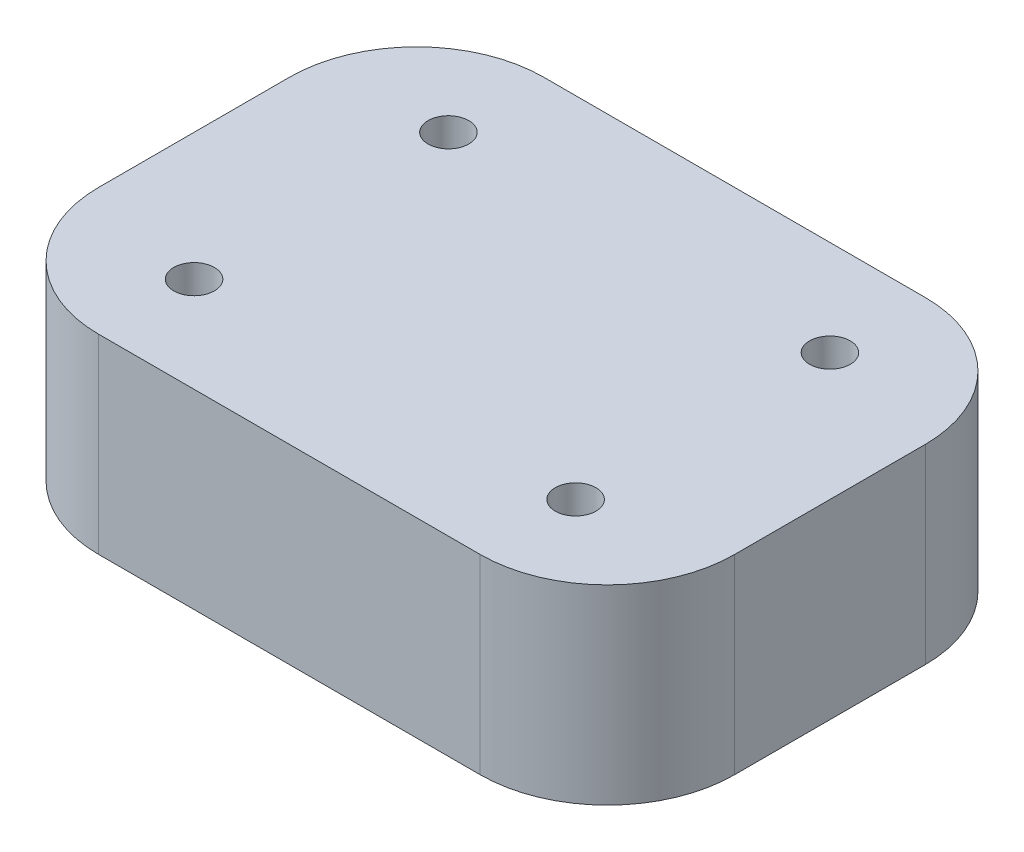
ISO-10303-21;
HEADER;
FILE_DESCRIPTION(('STEP AP214'),'2;1');
FILE_NAME('part.step','',(''),(''),'','','');
FILE_SCHEMA(('AUTOMOTIVE_DESIGN { 1 0 10303 214 1 1 1 1 }'));
ENDSEC;
DATA;
#1=APPLICATION_CONTEXT('core data for automotive mechanical design processes');
#2=APPLICATION_PROTOCOL_DEFINITION('international standard','automotive_design',2000,#1);
#3=PRODUCT_CONTEXT('',#1,'mechanical');
#4=PRODUCT('Part','Part','',(#3));
#5=PRODUCT_RELATED_PRODUCT_CATEGORY('part','',(#4));
#6=PRODUCT_DEFINITION_FORMATION('','',#4);
#7=PRODUCT_DEFINITION_CONTEXT('part definition',#1,'design');
#8=PRODUCT_DEFINITION('design','',#6,#7);
#9=PRODUCT_DEFINITION_SHAPE('','',#8);
#10=(LENGTH_UNIT() NAMED_UNIT(*) SI_UNIT(.MILLI.,.METRE.));
#11=(NAMED_UNIT(*) PLANE_ANGLE_UNIT() SI_UNIT($,.RADIAN.));
#12=(NAMED_UNIT(*) SI_UNIT($,.STERADIAN.) SOLID_ANGLE_UNIT());
#13=UNCERTAINTY_MEASURE_WITH_UNIT(LENGTH_MEASURE(1.E-05),#10,'distance_accuracy_value','');
#14=(GEOMETRIC_REPRESENTATION_CONTEXT(3) GLOBAL_UNCERTAINTY_ASSIGNED_CONTEXT((#13)) GLOBAL_UNIT_ASSIGNED_CONTEXT((#10,
#11,#12)) REPRESENTATION_CONTEXT('',''));
#15=CARTESIAN_POINT('',(0.,0.,0.));
#16=DIRECTION('',(0.,0.,1.));
#17=DIRECTION('',(1.,0.,0.));
#18=AXIS2_PLACEMENT_3D('',#15,#16,#17);
#19=CARTESIAN_POINT('',(0.,15.,0.));
#20=DIRECTION('',(0.,-1.,0.));
#21=DIRECTION('',(0.,0.,-1.));
#22=AXIS2_PLACEMENT_3D('',#19,#20,#21);
#23=PLANE('',#22);
#24=DIRECTION('',(-1.,0.,0.));
#25=VECTOR('',#24,1.);
#26=CARTESIAN_POINT('',(0.,15.,-35.));
#27=LINE('',#26,#25);
#28=CARTESIAN_POINT('',(40.,15.,-35.));
#29=VERTEX_POINT('',#28);
#30=CARTESIAN_POINT('',(10.,15.,-35.));
#31=VERTEX_POINT('',#30);
#32=EDGE_CURVE('E153',#29,#31,#27,.T.);
#33=ORIENTED_EDGE('',*,*,#32,.T.);
#34=CARTESIAN_POINT('',(10.,15.,-25.));
#35=DIRECTION('',(0.,-1.,0.));
#36=DIRECTION('',(0.,0.,-1.));
#37=AXIS2_PLACEMENT_3D('',#34,#35,#36);
#38=CIRCLE('',#37,10.);
#39=CARTESIAN_POINT('',(0.,15.,-25.));
#40=VERTEX_POINT('',#39);
#41=EDGE_CURVE('E183',#31,#40,#38,.F.);
#42=ORIENTED_EDGE('',*,*,#41,.T.);
#43=DIRECTION('',(0.,0.,1.));
#44=VECTOR('',#43,1.);
#45=CARTESIAN_POINT('',(0.,15.,0.));
#46=LINE('',#45,#44);
#47=CARTESIAN_POINT('',(0.,15.,-10.));
#48=VERTEX_POINT('',#47);
#49=EDGE_CURVE('E132',#40,#48,#46,.T.);
#50=ORIENTED_EDGE('',*,*,#49,.T.);
#51=CARTESIAN_POINT('',(10.,15.,-10.));
#52=DIRECTION('',(0.,-1.,0.));
#53=DIRECTION('',(0.,0.,-1.));
#54=AXIS2_PLACEMENT_3D('',#51,#52,#53);
#55=CIRCLE('',#54,10.);
#56=CARTESIAN_POINT('',(10.,15.,0.));
#57=VERTEX_POINT('',#56);
#58=EDGE_CURVE('E175',#48,#57,#55,.F.);
#59=ORIENTED_EDGE('',*,*,#58,.T.);
#60=DIRECTION('',(1.,0.,0.));
#61=VECTOR('',#60,1.);
#62=CARTESIAN_POINT('',(0.,15.,0.));
#63=LINE('',#62,#61);
#64=CARTESIAN_POINT('',(40.,15.,0.));
#65=VERTEX_POINT('',#64);
#66=EDGE_CURVE('E198',#57,#65,#63,.T.);
#67=ORIENTED_EDGE('',*,*,#66,.T.);
#68=CARTESIAN_POINT('',(40.,15.,-10.));
#69=DIRECTION('',(0.,-1.,0.));
#70=DIRECTION('',(0.,0.,-1.));
#71=AXIS2_PLACEMENT_3D('',#68,#69,#70);
#72=CIRCLE('',#71,10.);
#73=CARTESIAN_POINT('',(50.,15.,-10.));
#74=VERTEX_POINT('',#73);
#75=EDGE_CURVE('E67',#65,#74,#72,.F.);
#76=ORIENTED_EDGE('',*,*,#75,.T.);
#77=DIRECTION('',(0.,0.,-1.));
#78=VECTOR('',#77,1.);
#79=CARTESIAN_POINT('',(50.,15.,0.));
#80=LINE('',#79,#78);
#81=CARTESIAN_POINT('',(50.,15.,-25.));
#82=VERTEX_POINT('',#81);
#83=EDGE_CURVE('E206',#74,#82,#80,.T.);
#84=ORIENTED_EDGE('',*,*,#83,.T.);
#85=CARTESIAN_POINT('',(40.,15.,-25.));
#86=DIRECTION('',(0.,-1.,0.));
#87=DIRECTION('',(0.,0.,-1.));
#88=AXIS2_PLACEMENT_3D('',#85,#86,#87);
#89=CIRCLE('',#88,10.);
#90=EDGE_CURVE('E180',#82,#29,#89,.F.);
#91=ORIENTED_EDGE('',*,*,#90,.T.);
#92=EDGE_LOOP('',(#33,#42,#50,#59,#67,#76,#84,#91));
#93=FACE_BOUND('',#92,.T.);
#94=CARTESIAN_POINT('',(10.,15.,-27.5));
#95=DIRECTION('',(0.,1.,0.));
#96=DIRECTION('',(0.,0.,1.));
#97=AXIS2_PLACEMENT_3D('',#94,#95,#96);
#98=CIRCLE('',#97,1.6);
#99=CARTESIAN_POINT('',(10.,15.,-25.9));
#100=VERTEX_POINT('',#99);
#101=EDGE_CURVE('E142',#100,#100,#98,.T.);
#102=ORIENTED_EDGE('',*,*,#101,.F.);
#103=EDGE_LOOP('',(#102));
#104=FACE_BOUND('',#103,.T.);
#105=CARTESIAN_POINT('',(40.,15.,-27.5));
#106=DIRECTION('',(0.,1.,0.));
#107=DIRECTION('',(0.,0.,1.));
#108=AXIS2_PLACEMENT_3D('',#105,#106,#107);
#109=CIRCLE('',#108,1.6);
#110=CARTESIAN_POINT('',(40.,15.,-25.9));
#111=VERTEX_POINT('',#110);
#112=EDGE_CURVE('E218',#111,#111,#109,.T.);
#113=ORIENTED_EDGE('',*,*,#112,.F.);
#114=EDGE_LOOP('',(#113));
#115=FACE_BOUND('',#114,.T.);
#116=CARTESIAN_POINT('',(40.,15.,-7.5));
#117=DIRECTION('',(0.,1.,0.));
#118=DIRECTION('',(0.,0.,-1.));
#119=AXIS2_PLACEMENT_3D('',#116,#117,#118);
#120=CIRCLE('',#119,1.6);
#121=CARTESIAN_POINT('',(40.,15.,-9.1));
#122=VERTEX_POINT('',#121);
#123=EDGE_CURVE('E224',#122,#122,#120,.T.);
#124=ORIENTED_EDGE('',*,*,#123,.F.);
#125=EDGE_LOOP('',(#124));
#126=FACE_BOUND('',#125,.T.);
#127=CARTESIAN_POINT('',(10.,15.,-7.5));
#128=DIRECTION('',(0.,1.,0.));
#129=DIRECTION('',(0.,0.,-1.));
#130=AXIS2_PLACEMENT_3D('',#127,#128,#129);
#131=CIRCLE('',#130,1.6);
#132=CARTESIAN_POINT('',(10.,15.,-9.1));
#133=VERTEX_POINT('',#132);
#134=EDGE_CURVE('E232',#133,#133,#131,.T.);
#135=ORIENTED_EDGE('',*,*,#134,.F.);
#136=EDGE_LOOP('',(#135));
#137=FACE_BOUND('',#136,.T.);
#138=ADVANCED_FACE('F44',(#93,#104,#115,#126,#137),#23,.F.);
#139=CARTESIAN_POINT('',(0.,0.,0.));
#140=DIRECTION('',(0.,-1.,0.));
#141=DIRECTION('',(0.,0.,-1.));
#142=AXIS2_PLACEMENT_3D('',#139,#140,#141);
#143=PLANE('',#142);
#144=CARTESIAN_POINT('',(40.,0.,-7.5));
#145=DIRECTION('',(0.,1.,0.));
#146=DIRECTION('',(0.,0.,-1.));
#147=AXIS2_PLACEMENT_3D('',#144,#145,#146);
#148=CIRCLE('',#147,1.6);
#149=CARTESIAN_POINT('',(40.,0.,-9.1));
#150=VERTEX_POINT('',#149);
#151=EDGE_CURVE('E228',#150,#150,#148,.T.);
#152=ORIENTED_EDGE('',*,*,#151,.T.);
#153=EDGE_LOOP('',(#152));
#154=FACE_BOUND('',#153,.T.);
#155=CARTESIAN_POINT('',(10.,0.,-27.5));
#156=DIRECTION('',(0.,1.,0.));
#157=DIRECTION('',(0.,0.,1.));
#158=AXIS2_PLACEMENT_3D('',#155,#156,#157);
#159=CIRCLE('',#158,1.6);
#160=CARTESIAN_POINT('',(10.,0.,-25.9));
#161=VERTEX_POINT('',#160);
#162=EDGE_CURVE('E150',#161,#161,#159,.T.);
#163=ORIENTED_EDGE('',*,*,#162,.T.);
#164=EDGE_LOOP('',(#163));
#165=FACE_BOUND('',#164,.T.);
#166=DIRECTION('',(0.,0.,1.));
#167=VECTOR('',#166,1.);
#168=CARTESIAN_POINT('',(0.,0.,0.));
#169=LINE('',#168,#167);
#170=CARTESIAN_POINT('',(0.,0.,-25.));
#171=VERTEX_POINT('',#170);
#172=CARTESIAN_POINT('',(0.,0.,-10.));
#173=VERTEX_POINT('',#172);
#174=EDGE_CURVE('E129',#171,#173,#169,.T.);
#175=ORIENTED_EDGE('',*,*,#174,.F.);
#176=CARTESIAN_POINT('',(10.,0.,-25.));
#177=DIRECTION('',(0.,-1.,0.));
#178=DIRECTION('',(0.,0.,-1.));
#179=AXIS2_PLACEMENT_3D('',#176,#177,#178);
#180=CIRCLE('',#179,10.);
#181=CARTESIAN_POINT('',(10.,0.,-35.));
#182=VERTEX_POINT('',#181);
#183=EDGE_CURVE('E111',#171,#182,#180,.T.);
#184=ORIENTED_EDGE('',*,*,#183,.T.);
#185=DIRECTION('',(-1.,0.,0.));
#186=VECTOR('',#185,1.);
#187=CARTESIAN_POINT('',(0.,0.,-35.));
#188=LINE('',#187,#186);
#189=CARTESIAN_POINT('',(40.,0.,-35.));
#190=VERTEX_POINT('',#189);
#191=EDGE_CURVE('E158',#190,#182,#188,.T.);
#192=ORIENTED_EDGE('',*,*,#191,.F.);
#193=CARTESIAN_POINT('',(40.,0.,-25.));
#194=DIRECTION('',(0.,-1.,0.));
#195=DIRECTION('',(0.,0.,-1.));
#196=AXIS2_PLACEMENT_3D('',#193,#194,#195);
#197=CIRCLE('',#196,10.);
#198=CARTESIAN_POINT('',(50.,0.,-25.));
#199=VERTEX_POINT('',#198);
#200=EDGE_CURVE('E123',#190,#199,#197,.T.);
#201=ORIENTED_EDGE('',*,*,#200,.T.);
#202=DIRECTION('',(0.,0.,-1.));
#203=VECTOR('',#202,1.);
#204=CARTESIAN_POINT('',(50.,0.,0.));
#205=LINE('',#204,#203);
#206=CARTESIAN_POINT('',(50.,0.,-10.));
#207=VERTEX_POINT('',#206);
#208=EDGE_CURVE('E147',#207,#199,#205,.T.);
#209=ORIENTED_EDGE('',*,*,#208,.F.);
#210=CARTESIAN_POINT('',(40.,0.,-10.));
#211=DIRECTION('',(0.,-1.,0.));
#212=DIRECTION('',(0.,0.,-1.));
#213=AXIS2_PLACEMENT_3D('',#210,#211,#212);
#214=CIRCLE('',#213,10.);
#215=CARTESIAN_POINT('',(40.,0.,0.));
#216=VERTEX_POINT('',#215);
#217=EDGE_CURVE('E165',#207,#216,#214,.T.);
#218=ORIENTED_EDGE('',*,*,#217,.T.);
#219=DIRECTION('',(1.,0.,0.));
#220=VECTOR('',#219,1.);
#221=CARTESIAN_POINT('',(0.,0.,0.));
#222=LINE('',#221,#220);
#223=CARTESIAN_POINT('',(10.,0.,0.));
#224=VERTEX_POINT('',#223);
#225=EDGE_CURVE('E141',#224,#216,#222,.T.);
#226=ORIENTED_EDGE('',*,*,#225,.F.);
#227=CARTESIAN_POINT('',(10.,0.,-10.));
#228=DIRECTION('',(0.,-1.,0.));
#229=DIRECTION('',(0.,0.,-1.));
#230=AXIS2_PLACEMENT_3D('',#227,#228,#229);
#231=CIRCLE('',#230,10.);
#232=EDGE_CURVE('E134',#224,#173,#231,.T.);
#233=ORIENTED_EDGE('',*,*,#232,.T.);
#234=EDGE_LOOP('',(#175,#184,#192,#201,#209,#218,#226,#233));
#235=FACE_BOUND('',#234,.T.);
#236=CARTESIAN_POINT('',(40.,0.,-27.5));
#237=DIRECTION('',(0.,1.,0.));
#238=DIRECTION('',(0.,0.,1.));
#239=AXIS2_PLACEMENT_3D('',#236,#237,#238);
#240=CIRCLE('',#239,1.6);
#241=CARTESIAN_POINT('',(40.,0.,-25.9));
#242=VERTEX_POINT('',#241);
#243=EDGE_CURVE('E220',#242,#242,#240,.T.);
#244=ORIENTED_EDGE('',*,*,#243,.T.);
#245=EDGE_LOOP('',(#244));
#246=FACE_BOUND('',#245,.T.);
#247=CARTESIAN_POINT('',(10.,0.,-7.5));
#248=DIRECTION('',(0.,1.,0.));
#249=DIRECTION('',(0.,0.,-1.));
#250=AXIS2_PLACEMENT_3D('',#247,#248,#249);
#251=CIRCLE('',#250,1.6);
#252=CARTESIAN_POINT('',(10.,0.,-9.1));
#253=VERTEX_POINT('',#252);
#254=EDGE_CURVE('E236',#253,#253,#251,.T.);
#255=ORIENTED_EDGE('',*,*,#254,.T.);
#256=EDGE_LOOP('',(#255));
#257=FACE_BOUND('',#256,.T.);
#258=ADVANCED_FACE('F137',(#154,#165,#235,#246,#257),#143,.T.);
#259=CARTESIAN_POINT('',(0.,15.,0.));
#260=DIRECTION('',(1.,0.,0.));
#261=DIRECTION('',(0.,0.,-1.));
#262=AXIS2_PLACEMENT_3D('',#259,#260,#261);
#263=PLANE('',#262);
#264=ORIENTED_EDGE('',*,*,#49,.F.);
#265=DIRECTION('',(0.,-1.,0.));
#266=VECTOR('',#265,1.);
#267=CARTESIAN_POINT('',(0.,15.,-25.));
#268=LINE('',#267,#266);
#269=EDGE_CURVE('E115',#40,#171,#268,.T.);
#270=ORIENTED_EDGE('',*,*,#269,.T.);
#271=ORIENTED_EDGE('',*,*,#174,.T.);
#272=DIRECTION('',(0.,-1.,0.));
#273=VECTOR('',#272,1.);
#274=CARTESIAN_POINT('',(0.,15.,-10.));
#275=LINE('',#274,#273);
#276=EDGE_CURVE('E135',#173,#48,#275,.F.);
#277=ORIENTED_EDGE('',*,*,#276,.T.);
#278=EDGE_LOOP('',(#264,#270,#271,#277));
#279=FACE_BOUND('',#278,.T.);
#280=ADVANCED_FACE('F128',(#279),#263,.F.);
#281=CARTESIAN_POINT('',(0.,15.,0.));
#282=DIRECTION('',(0.,0.,-1.));
#283=DIRECTION('',(-1.,0.,0.));
#284=AXIS2_PLACEMENT_3D('',#281,#282,#283);
#285=PLANE('',#284);
#286=ORIENTED_EDGE('',*,*,#225,.T.);
#287=DIRECTION('',(0.,-1.,0.));
#288=VECTOR('',#287,1.);
#289=CARTESIAN_POINT('',(40.,15.,0.));
#290=LINE('',#289,#288);
#291=EDGE_CURVE('E11',#216,#65,#290,.F.);
#292=ORIENTED_EDGE('',*,*,#291,.T.);
#293=ORIENTED_EDGE('',*,*,#66,.F.);
#294=DIRECTION('',(0.,-1.,0.));
#295=VECTOR('',#294,1.);
#296=CARTESIAN_POINT('',(10.,15.,0.));
#297=LINE('',#296,#295);
#298=EDGE_CURVE('E53',#57,#224,#297,.T.);
#299=ORIENTED_EDGE('',*,*,#298,.T.);
#300=EDGE_LOOP('',(#286,#292,#293,#299));
#301=FACE_BOUND('',#300,.T.);
#302=ADVANCED_FACE('F196',(#301),#285,.F.);
#303=CARTESIAN_POINT('',(50.,15.,0.));
#304=DIRECTION('',(-1.,0.,0.));
#305=DIRECTION('',(0.,0.,1.));
#306=AXIS2_PLACEMENT_3D('',#303,#304,#305);
#307=PLANE('',#306);
#308=ORIENTED_EDGE('',*,*,#208,.T.);
#309=DIRECTION('',(0.,-1.,0.));
#310=VECTOR('',#309,1.);
#311=CARTESIAN_POINT('',(50.,15.,-25.));
#312=LINE('',#311,#310);
#313=EDGE_CURVE('E60',#199,#82,#312,.F.);
#314=ORIENTED_EDGE('',*,*,#313,.T.);
#315=ORIENTED_EDGE('',*,*,#83,.F.);
#316=DIRECTION('',(0.,-1.,0.));
#317=VECTOR('',#316,1.);
#318=CARTESIAN_POINT('',(50.,15.,-10.));
#319=LINE('',#318,#317);
#320=EDGE_CURVE('E186',#74,#207,#319,.T.);
#321=ORIENTED_EDGE('',*,*,#320,.T.);
#322=EDGE_LOOP('',(#308,#314,#315,#321));
#323=FACE_BOUND('',#322,.T.);
#324=ADVANCED_FACE('F205',(#323),#307,.F.);
#325=CARTESIAN_POINT('',(0.,15.,-35.));
#326=DIRECTION('',(0.,0.,1.));
#327=DIRECTION('',(1.,0.,0.));
#328=AXIS2_PLACEMENT_3D('',#325,#326,#327);
#329=PLANE('',#328);
#330=ORIENTED_EDGE('',*,*,#191,.T.);
#331=DIRECTION('',(0.,-1.,0.));
#332=VECTOR('',#331,1.);
#333=CARTESIAN_POINT('',(10.,15.,-35.));
#334=LINE('',#333,#332);
#335=EDGE_CURVE('E116',#182,#31,#334,.F.);
#336=ORIENTED_EDGE('',*,*,#335,.T.);
#337=ORIENTED_EDGE('',*,*,#32,.F.);
#338=DIRECTION('',(0.,-1.,0.));
#339=VECTOR('',#338,1.);
#340=CARTESIAN_POINT('',(40.,15.,-35.));
#341=LINE('',#340,#339);
#342=EDGE_CURVE('E122',#29,#190,#341,.T.);
#343=ORIENTED_EDGE('',*,*,#342,.T.);
#344=EDGE_LOOP('',(#330,#336,#337,#343));
#345=FACE_BOUND('',#344,.T.);
#346=ADVANCED_FACE('F259',(#345),#329,.F.);
#347=CARTESIAN_POINT('',(10.,15.,-27.5));
#348=DIRECTION('',(0.,-1.,0.));
#349=DIRECTION('',(0.,0.,-1.));
#350=AXIS2_PLACEMENT_3D('',#347,#348,#349);
#351=CYLINDRICAL_SURFACE('',#350,1.6);
#352=ORIENTED_EDGE('',*,*,#101,.T.);
#353=EDGE_LOOP('',(#352));
#354=FACE_BOUND('',#353,.T.);
#355=ORIENTED_EDGE('',*,*,#162,.F.);
#356=EDGE_LOOP('',(#355));
#357=FACE_BOUND('',#356,.T.);
#358=ADVANCED_FACE('F256',(#354,#357),#351,.F.);
#359=CARTESIAN_POINT('',(40.,15.,-27.5));
#360=DIRECTION('',(0.,-1.,0.));
#361=DIRECTION('',(0.,0.,-1.));
#362=AXIS2_PLACEMENT_3D('',#359,#360,#361);
#363=CYLINDRICAL_SURFACE('',#362,1.6);
#364=ORIENTED_EDGE('',*,*,#112,.T.);
#365=EDGE_LOOP('',(#364));
#366=FACE_BOUND('',#365,.T.);
#367=ORIENTED_EDGE('',*,*,#243,.F.);
#368=EDGE_LOOP('',(#367));
#369=FACE_BOUND('',#368,.T.);
#370=ADVANCED_FACE('F363',(#366,#369),#363,.F.);
#371=CARTESIAN_POINT('',(40.,15.,-7.5));
#372=DIRECTION('',(0.,-1.,0.));
#373=DIRECTION('',(0.,0.,-1.));
#374=AXIS2_PLACEMENT_3D('',#371,#372,#373);
#375=CYLINDRICAL_SURFACE('',#374,1.6);
#376=ORIENTED_EDGE('',*,*,#123,.T.);
#377=EDGE_LOOP('',(#376));
#378=FACE_BOUND('',#377,.T.);
#379=ORIENTED_EDGE('',*,*,#151,.F.);
#380=EDGE_LOOP('',(#379));
#381=FACE_BOUND('',#380,.T.);
#382=ADVANCED_FACE('F353',(#378,#381),#375,.F.);
#383=CARTESIAN_POINT('',(10.,15.,-7.5));
#384=DIRECTION('',(0.,-1.,0.));
#385=DIRECTION('',(0.,0.,-1.));
#386=AXIS2_PLACEMENT_3D('',#383,#384,#385);
#387=CYLINDRICAL_SURFACE('',#386,1.6);
#388=ORIENTED_EDGE('',*,*,#134,.T.);
#389=EDGE_LOOP('',(#388));
#390=FACE_BOUND('',#389,.T.);
#391=ORIENTED_EDGE('',*,*,#254,.F.);
#392=EDGE_LOOP('',(#391));
#393=FACE_BOUND('',#392,.T.);
#394=ADVANCED_FACE('F244',(#390,#393),#387,.F.);
#395=CARTESIAN_POINT('',(10.,15.,-25.));
#396=DIRECTION('',(0.,-1.,0.));
#397=DIRECTION('',(0.,0.,-1.));
#398=AXIS2_PLACEMENT_3D('',#395,#396,#397);
#399=CYLINDRICAL_SURFACE('',#398,10.);
#400=ORIENTED_EDGE('',*,*,#41,.F.);
#401=ORIENTED_EDGE('',*,*,#335,.F.);
#402=ORIENTED_EDGE('',*,*,#183,.F.);
#403=ORIENTED_EDGE('',*,*,#269,.F.);
#404=EDGE_LOOP('',(#400,#401,#402,#403));
#405=FACE_BOUND('',#404,.T.);
#406=ADVANCED_FACE('F114',(#405),#399,.T.);
#407=CARTESIAN_POINT('',(40.,15.,-25.));
#408=DIRECTION('',(0.,-1.,0.));
#409=DIRECTION('',(0.,0.,-1.));
#410=AXIS2_PLACEMENT_3D('',#407,#408,#409);
#411=CYLINDRICAL_SURFACE('',#410,10.);
#412=ORIENTED_EDGE('',*,*,#90,.F.);
#413=ORIENTED_EDGE('',*,*,#313,.F.);
#414=ORIENTED_EDGE('',*,*,#200,.F.);
#415=ORIENTED_EDGE('',*,*,#342,.F.);
#416=EDGE_LOOP('',(#412,#413,#414,#415));
#417=FACE_BOUND('',#416,.T.);
#418=ADVANCED_FACE('F271',(#417),#411,.T.);
#419=CARTESIAN_POINT('',(40.,15.,-10.));
#420=DIRECTION('',(0.,-1.,0.));
#421=DIRECTION('',(0.,0.,-1.));
#422=AXIS2_PLACEMENT_3D('',#419,#420,#421);
#423=CYLINDRICAL_SURFACE('',#422,10.);
#424=ORIENTED_EDGE('',*,*,#75,.F.);
#425=ORIENTED_EDGE('',*,*,#291,.F.);
#426=ORIENTED_EDGE('',*,*,#217,.F.);
#427=ORIENTED_EDGE('',*,*,#320,.F.);
#428=EDGE_LOOP('',(#424,#425,#426,#427));
#429=FACE_BOUND('',#428,.T.);
#430=ADVANCED_FACE('F204',(#429),#423,.T.);
#431=CARTESIAN_POINT('',(10.,15.,-10.));
#432=DIRECTION('',(0.,-1.,0.));
#433=DIRECTION('',(0.,0.,-1.));
#434=AXIS2_PLACEMENT_3D('',#431,#432,#433);
#435=CYLINDRICAL_SURFACE('',#434,10.);
#436=ORIENTED_EDGE('',*,*,#58,.F.);
#437=ORIENTED_EDGE('',*,*,#276,.F.);
#438=ORIENTED_EDGE('',*,*,#232,.F.);
#439=ORIENTED_EDGE('',*,*,#298,.F.);
#440=EDGE_LOOP('',(#436,#437,#438,#439));
#441=FACE_BOUND('',#440,.T.);
#442=ADVANCED_FACE('F46',(#441),#435,.T.);
#443=CLOSED_SHELL('',(#138,#258,#280,#302,#324,#346,#358,#370,#382,#394,#406,#418,#430,#442));
#444=MANIFOLD_SOLID_BREP('B2',#443);
#445=ADVANCED_BREP_SHAPE_REPRESENTATION('',(#18,#444),#14);
#446=SHAPE_DEFINITION_REPRESENTATION(#9,#445);
ENDSEC;
END-ISO-10303-21;
